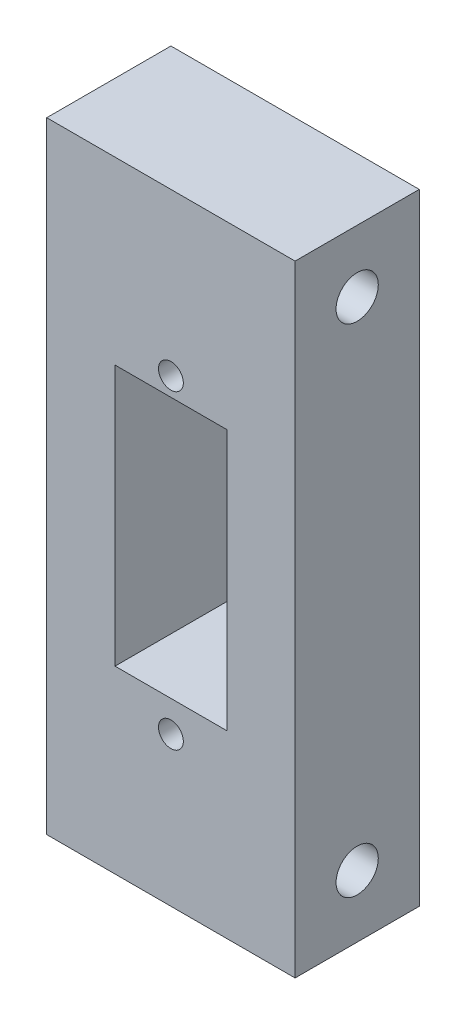
ISO-10303-21;
HEADER;
FILE_DESCRIPTION(('STEP AP214'),'2;1');
FILE_NAME('part.step','',(''),(''),'','','');
FILE_SCHEMA(('AUTOMOTIVE_DESIGN { 1 0 10303 214 1 1 1 1 }'));
ENDSEC;
DATA;
#1=APPLICATION_CONTEXT('core data for automotive mechanical design processes');
#2=APPLICATION_PROTOCOL_DEFINITION('international standard','automotive_design',2000,#1);
#3=PRODUCT_CONTEXT('',#1,'mechanical');
#4=PRODUCT('Part','Part','',(#3));
#5=PRODUCT_RELATED_PRODUCT_CATEGORY('part','',(#4));
#6=PRODUCT_DEFINITION_FORMATION('','',#4);
#7=PRODUCT_DEFINITION_CONTEXT('part definition',#1,'design');
#8=PRODUCT_DEFINITION('design','',#6,#7);
#9=PRODUCT_DEFINITION_SHAPE('','',#8);
#10=(LENGTH_UNIT() NAMED_UNIT(*) SI_UNIT(.MILLI.,.METRE.));
#11=(NAMED_UNIT(*) PLANE_ANGLE_UNIT() SI_UNIT($,.RADIAN.));
#12=(NAMED_UNIT(*) SI_UNIT($,.STERADIAN.) SOLID_ANGLE_UNIT());
#13=UNCERTAINTY_MEASURE_WITH_UNIT(LENGTH_MEASURE(1.E-05),#10,'distance_accuracy_value','');
#14=(GEOMETRIC_REPRESENTATION_CONTEXT(3) GLOBAL_UNCERTAINTY_ASSIGNED_CONTEXT((#13)) GLOBAL_UNIT_ASSIGNED_CONTEXT((#10,
#11,#12)) REPRESENTATION_CONTEXT('',''));
#15=CARTESIAN_POINT('',(0.,0.,0.));
#16=DIRECTION('',(0.,0.,1.));
#17=DIRECTION('',(1.,0.,0.));
#18=AXIS2_PLACEMENT_3D('',#15,#16,#17);
#19=CARTESIAN_POINT('',(0.,0.,10.));
#20=DIRECTION('',(0.,0.,-1.));
#21=DIRECTION('',(-1.,0.,0.));
#22=AXIS2_PLACEMENT_3D('',#19,#20,#21);
#23=PLANE('',#22);
#24=DIRECTION('',(0.,-1.,0.));
#25=VECTOR('',#24,1.);
#26=CARTESIAN_POINT('',(-10.,25.,10.));
#27=LINE('',#26,#25);
#28=CARTESIAN_POINT('',(-10.,25.,10.));
#29=VERTEX_POINT('',#28);
#30=CARTESIAN_POINT('',(-10.,-25.,10.));
#31=VERTEX_POINT('',#30);
#32=EDGE_CURVE('E141',#29,#31,#27,.T.);
#33=ORIENTED_EDGE('',*,*,#32,.T.);
#34=DIRECTION('',(1.,0.,0.));
#35=VECTOR('',#34,1.);
#36=CARTESIAN_POINT('',(10.,-25.,10.));
#37=LINE('',#36,#35);
#38=CARTESIAN_POINT('',(10.,-25.,10.));
#39=VERTEX_POINT('',#38);
#40=EDGE_CURVE('E144',#31,#39,#37,.T.);
#41=ORIENTED_EDGE('',*,*,#40,.T.);
#42=DIRECTION('',(0.,1.,0.));
#43=VECTOR('',#42,1.);
#44=CARTESIAN_POINT('',(10.,25.,10.));
#45=LINE('',#44,#43);
#46=CARTESIAN_POINT('',(10.,25.,10.));
#47=VERTEX_POINT('',#46);
#48=EDGE_CURVE('E147',#39,#47,#45,.T.);
#49=ORIENTED_EDGE('',*,*,#48,.T.);
#50=DIRECTION('',(-1.,0.,0.));
#51=VECTOR('',#50,1.);
#52=CARTESIAN_POINT('',(10.,25.,10.));
#53=LINE('',#52,#51);
#54=EDGE_CURVE('E149',#47,#29,#53,.T.);
#55=ORIENTED_EDGE('',*,*,#54,.T.);
#56=EDGE_LOOP('',(#33,#41,#49,#55));
#57=FACE_BOUND('',#56,.T.);
#58=DIRECTION('',(0.,-1.,0.));
#59=VECTOR('',#58,1.);
#60=CARTESIAN_POINT('',(-4.5,-10.5,10.));
#61=LINE('',#60,#59);
#62=CARTESIAN_POINT('',(-4.5,10.5,10.));
#63=VERTEX_POINT('',#62);
#64=CARTESIAN_POINT('',(-4.5,-10.5,10.));
#65=VERTEX_POINT('',#64);
#66=EDGE_CURVE('E102',#63,#65,#61,.T.);
#67=ORIENTED_EDGE('',*,*,#66,.F.);
#68=DIRECTION('',(-1.,0.,0.));
#69=VECTOR('',#68,1.);
#70=CARTESIAN_POINT('',(4.5,10.5,10.));
#71=LINE('',#70,#69);
#72=CARTESIAN_POINT('',(4.5,10.5,10.));
#73=VERTEX_POINT('',#72);
#74=EDGE_CURVE('E125',#73,#63,#71,.T.);
#75=ORIENTED_EDGE('',*,*,#74,.F.);
#76=DIRECTION('',(0.,1.,0.));
#77=VECTOR('',#76,1.);
#78=CARTESIAN_POINT('',(4.5,-10.5,10.));
#79=LINE('',#78,#77);
#80=CARTESIAN_POINT('',(4.5,-10.5,10.));
#81=VERTEX_POINT('',#80);
#82=EDGE_CURVE('E123',#81,#73,#79,.T.);
#83=ORIENTED_EDGE('',*,*,#82,.F.);
#84=DIRECTION('',(1.,0.,0.));
#85=VECTOR('',#84,1.);
#86=CARTESIAN_POINT('',(4.5,-10.5,10.));
#87=LINE('',#86,#85);
#88=EDGE_CURVE('E110',#65,#81,#87,.T.);
#89=ORIENTED_EDGE('',*,*,#88,.F.);
#90=EDGE_LOOP('',(#67,#75,#83,#89));
#91=FACE_BOUND('',#90,.T.);
#92=CARTESIAN_POINT('',(0.,-13.,10.));
#93=DIRECTION('',(0.,0.,1.));
#94=DIRECTION('',(1.,0.,0.));
#95=AXIS2_PLACEMENT_3D('',#92,#93,#94);
#96=CIRCLE('',#95,1.);
#97=CARTESIAN_POINT('',(1.,-13.,10.));
#98=VERTEX_POINT('',#97);
#99=EDGE_CURVE('E131',#98,#98,#96,.T.);
#100=ORIENTED_EDGE('',*,*,#99,.F.);
#101=EDGE_LOOP('',(#100));
#102=FACE_BOUND('',#101,.T.);
#103=CARTESIAN_POINT('',(0.,12.,10.));
#104=DIRECTION('',(0.,0.,1.));
#105=DIRECTION('',(1.,0.,0.));
#106=AXIS2_PLACEMENT_3D('',#103,#104,#105);
#107=CIRCLE('',#106,1.);
#108=CARTESIAN_POINT('',(1.,12.,10.));
#109=VERTEX_POINT('',#108);
#110=EDGE_CURVE('E254',#109,#109,#107,.T.);
#111=ORIENTED_EDGE('',*,*,#110,.F.);
#112=EDGE_LOOP('',(#111));
#113=FACE_BOUND('',#112,.T.);
#114=ADVANCED_FACE('F37',(#57,#91,#102,#113),#23,.F.);
#115=CARTESIAN_POINT('',(0.,0.,0.));
#116=DIRECTION('',(0.,0.,-1.));
#117=DIRECTION('',(-1.,0.,0.));
#118=AXIS2_PLACEMENT_3D('',#115,#116,#117);
#119=PLANE('',#118);
#120=CARTESIAN_POINT('',(0.,-13.,0.));
#121=DIRECTION('',(0.,0.,1.));
#122=DIRECTION('',(1.,0.,0.));
#123=AXIS2_PLACEMENT_3D('',#120,#121,#122);
#124=CIRCLE('',#123,1.);
#125=CARTESIAN_POINT('',(1.,-13.,0.));
#126=VERTEX_POINT('',#125);
#127=EDGE_CURVE('E257',#126,#126,#124,.T.);
#128=ORIENTED_EDGE('',*,*,#127,.T.);
#129=EDGE_LOOP('',(#128));
#130=FACE_BOUND('',#129,.T.);
#131=DIRECTION('',(0.,-1.,0.));
#132=VECTOR('',#131,1.);
#133=CARTESIAN_POINT('',(-10.,25.,0.));
#134=LINE('',#133,#132);
#135=CARTESIAN_POINT('',(-10.,25.,0.));
#136=VERTEX_POINT('',#135);
#137=CARTESIAN_POINT('',(-10.,-25.,0.));
#138=VERTEX_POINT('',#137);
#139=EDGE_CURVE('E118',#136,#138,#134,.T.);
#140=ORIENTED_EDGE('',*,*,#139,.F.);
#141=DIRECTION('',(-1.,0.,0.));
#142=VECTOR('',#141,1.);
#143=CARTESIAN_POINT('',(10.,25.,0.));
#144=LINE('',#143,#142);
#145=CARTESIAN_POINT('',(10.,25.,0.));
#146=VERTEX_POINT('',#145);
#147=EDGE_CURVE('E145',#146,#136,#144,.T.);
#148=ORIENTED_EDGE('',*,*,#147,.F.);
#149=DIRECTION('',(0.,1.,0.));
#150=VECTOR('',#149,1.);
#151=CARTESIAN_POINT('',(10.,25.,0.));
#152=LINE('',#151,#150);
#153=CARTESIAN_POINT('',(10.,-25.,0.));
#154=VERTEX_POINT('',#153);
#155=EDGE_CURVE('E156',#154,#146,#152,.T.);
#156=ORIENTED_EDGE('',*,*,#155,.F.);
#157=DIRECTION('',(1.,0.,0.));
#158=VECTOR('',#157,1.);
#159=CARTESIAN_POINT('',(10.,-25.,0.));
#160=LINE('',#159,#158);
#161=EDGE_CURVE('E154',#138,#154,#160,.T.);
#162=ORIENTED_EDGE('',*,*,#161,.F.);
#163=EDGE_LOOP('',(#140,#148,#156,#162));
#164=FACE_BOUND('',#163,.T.);
#165=DIRECTION('',(-1.,0.,0.));
#166=VECTOR('',#165,1.);
#167=CARTESIAN_POINT('',(4.5,10.5,0.));
#168=LINE('',#167,#166);
#169=CARTESIAN_POINT('',(4.5,10.5,0.));
#170=VERTEX_POINT('',#169);
#171=CARTESIAN_POINT('',(-4.5,10.5,0.));
#172=VERTEX_POINT('',#171);
#173=EDGE_CURVE('E111',#170,#172,#168,.T.);
#174=ORIENTED_EDGE('',*,*,#173,.T.);
#175=DIRECTION('',(0.,-1.,0.));
#176=VECTOR('',#175,1.);
#177=CARTESIAN_POINT('',(-4.5,-10.5,0.));
#178=LINE('',#177,#176);
#179=CARTESIAN_POINT('',(-4.5,-10.5,0.));
#180=VERTEX_POINT('',#179);
#181=EDGE_CURVE('E60',#172,#180,#178,.T.);
#182=ORIENTED_EDGE('',*,*,#181,.T.);
#183=DIRECTION('',(1.,0.,0.));
#184=VECTOR('',#183,1.);
#185=CARTESIAN_POINT('',(4.5,-10.5,0.));
#186=LINE('',#185,#184);
#187=CARTESIAN_POINT('',(4.5,-10.5,0.));
#188=VERTEX_POINT('',#187);
#189=EDGE_CURVE('E117',#180,#188,#186,.T.);
#190=ORIENTED_EDGE('',*,*,#189,.T.);
#191=DIRECTION('',(0.,1.,0.));
#192=VECTOR('',#191,1.);
#193=CARTESIAN_POINT('',(4.5,-10.5,0.));
#194=LINE('',#193,#192);
#195=EDGE_CURVE('E133',#188,#170,#194,.T.);
#196=ORIENTED_EDGE('',*,*,#195,.T.);
#197=EDGE_LOOP('',(#174,#182,#190,#196));
#198=FACE_BOUND('',#197,.T.);
#199=CARTESIAN_POINT('',(0.,12.,0.));
#200=DIRECTION('',(0.,0.,1.));
#201=DIRECTION('',(1.,0.,0.));
#202=AXIS2_PLACEMENT_3D('',#199,#200,#201);
#203=CIRCLE('',#202,1.);
#204=CARTESIAN_POINT('',(1.,12.,0.));
#205=VERTEX_POINT('',#204);
#206=EDGE_CURVE('E246',#205,#205,#203,.T.);
#207=ORIENTED_EDGE('',*,*,#206,.T.);
#208=EDGE_LOOP('',(#207));
#209=FACE_BOUND('',#208,.T.);
#210=ADVANCED_FACE('F174',(#130,#164,#198,#209),#119,.T.);
#211=CARTESIAN_POINT('',(-10.,25.,10.));
#212=DIRECTION('',(1.,0.,0.));
#213=DIRECTION('',(0.,0.,-1.));
#214=AXIS2_PLACEMENT_3D('',#211,#212,#213);
#215=PLANE('',#214);
#216=CARTESIAN_POINT('',(-10.,-20.,5.));
#217=DIRECTION('',(1.,0.,0.));
#218=DIRECTION('',(0.,0.,-1.));
#219=AXIS2_PLACEMENT_3D('',#216,#217,#218);
#220=CIRCLE('',#219,1.7);
#221=CARTESIAN_POINT('',(-10.,-20.,3.3));
#222=VERTEX_POINT('',#221);
#223=EDGE_CURVE('E240',#222,#222,#220,.T.);
#224=ORIENTED_EDGE('',*,*,#223,.T.);
#225=EDGE_LOOP('',(#224));
#226=FACE_BOUND('',#225,.T.);
#227=CARTESIAN_POINT('',(-10.,20.,5.));
#228=DIRECTION('',(1.,0.,0.));
#229=DIRECTION('',(0.,0.,-1.));
#230=AXIS2_PLACEMENT_3D('',#227,#228,#229);
#231=CIRCLE('',#230,1.7);
#232=CARTESIAN_POINT('',(-10.,20.,3.3));
#233=VERTEX_POINT('',#232);
#234=EDGE_CURVE('E244',#233,#233,#231,.T.);
#235=ORIENTED_EDGE('',*,*,#234,.T.);
#236=EDGE_LOOP('',(#235));
#237=FACE_BOUND('',#236,.T.);
#238=ORIENTED_EDGE('',*,*,#139,.T.);
#239=DIRECTION('',(0.,0.,-1.));
#240=VECTOR('',#239,1.);
#241=CARTESIAN_POINT('',(-10.,-25.,10.));
#242=LINE('',#241,#240);
#243=EDGE_CURVE('E11',#31,#138,#242,.T.);
#244=ORIENTED_EDGE('',*,*,#243,.F.);
#245=ORIENTED_EDGE('',*,*,#32,.F.);
#246=DIRECTION('',(0.,0.,-1.));
#247=VECTOR('',#246,1.);
#248=CARTESIAN_POINT('',(-10.,25.,10.));
#249=LINE('',#248,#247);
#250=EDGE_CURVE('E151',#29,#136,#249,.T.);
#251=ORIENTED_EDGE('',*,*,#250,.T.);
#252=EDGE_LOOP('',(#238,#244,#245,#251));
#253=FACE_BOUND('',#252,.T.);
#254=ADVANCED_FACE('F39',(#226,#237,#253),#215,.F.);
#255=CARTESIAN_POINT('',(10.,-25.,10.));
#256=DIRECTION('',(0.,1.,0.));
#257=DIRECTION('',(0.,0.,1.));
#258=AXIS2_PLACEMENT_3D('',#255,#256,#257);
#259=PLANE('',#258);
#260=ORIENTED_EDGE('',*,*,#161,.T.);
#261=DIRECTION('',(0.,0.,-1.));
#262=VECTOR('',#261,1.);
#263=CARTESIAN_POINT('',(10.,-25.,10.));
#264=LINE('',#263,#262);
#265=EDGE_CURVE('E45',#39,#154,#264,.T.);
#266=ORIENTED_EDGE('',*,*,#265,.F.);
#267=ORIENTED_EDGE('',*,*,#40,.F.);
#268=ORIENTED_EDGE('',*,*,#243,.T.);
#269=EDGE_LOOP('',(#260,#266,#267,#268));
#270=FACE_BOUND('',#269,.T.);
#271=ADVANCED_FACE('F184',(#270),#259,.F.);
#272=CARTESIAN_POINT('',(10.,25.,10.));
#273=DIRECTION('',(-1.,0.,0.));
#274=DIRECTION('',(0.,0.,1.));
#275=AXIS2_PLACEMENT_3D('',#272,#273,#274);
#276=PLANE('',#275);
#277=CARTESIAN_POINT('',(10.,-20.,5.));
#278=DIRECTION('',(1.,0.,0.));
#279=DIRECTION('',(0.,0.,-1.));
#280=AXIS2_PLACEMENT_3D('',#277,#278,#279);
#281=CIRCLE('',#280,1.7);
#282=CARTESIAN_POINT('',(10.,-20.,3.3));
#283=VERTEX_POINT('',#282);
#284=EDGE_CURVE('E243',#283,#283,#281,.T.);
#285=ORIENTED_EDGE('',*,*,#284,.F.);
#286=EDGE_LOOP('',(#285));
#287=FACE_BOUND('',#286,.T.);
#288=CARTESIAN_POINT('',(10.,20.,5.));
#289=DIRECTION('',(1.,0.,0.));
#290=DIRECTION('',(0.,0.,-1.));
#291=AXIS2_PLACEMENT_3D('',#288,#289,#290);
#292=CIRCLE('',#291,1.7);
#293=CARTESIAN_POINT('',(10.,20.,3.3));
#294=VERTEX_POINT('',#293);
#295=EDGE_CURVE('E249',#294,#294,#292,.T.);
#296=ORIENTED_EDGE('',*,*,#295,.F.);
#297=EDGE_LOOP('',(#296));
#298=FACE_BOUND('',#297,.T.);
#299=ORIENTED_EDGE('',*,*,#155,.T.);
#300=DIRECTION('',(0.,0.,-1.));
#301=VECTOR('',#300,1.);
#302=CARTESIAN_POINT('',(10.,25.,10.));
#303=LINE('',#302,#301);
#304=EDGE_CURVE('E161',#47,#146,#303,.T.);
#305=ORIENTED_EDGE('',*,*,#304,.F.);
#306=ORIENTED_EDGE('',*,*,#48,.F.);
#307=ORIENTED_EDGE('',*,*,#265,.T.);
#308=EDGE_LOOP('',(#299,#305,#306,#307));
#309=FACE_BOUND('',#308,.T.);
#310=ADVANCED_FACE('F168',(#287,#298,#309),#276,.F.);
#311=CARTESIAN_POINT('',(10.,25.,10.));
#312=DIRECTION('',(0.,-1.,0.));
#313=DIRECTION('',(0.,0.,-1.));
#314=AXIS2_PLACEMENT_3D('',#311,#312,#313);
#315=PLANE('',#314);
#316=ORIENTED_EDGE('',*,*,#147,.T.);
#317=ORIENTED_EDGE('',*,*,#250,.F.);
#318=ORIENTED_EDGE('',*,*,#54,.F.);
#319=ORIENTED_EDGE('',*,*,#304,.T.);
#320=EDGE_LOOP('',(#316,#317,#318,#319));
#321=FACE_BOUND('',#320,.T.);
#322=ADVANCED_FACE('F178',(#321),#315,.F.);
#323=CARTESIAN_POINT('',(-4.5,-10.5,10.));
#324=DIRECTION('',(1.,0.,0.));
#325=DIRECTION('',(0.,0.,-1.));
#326=AXIS2_PLACEMENT_3D('',#323,#324,#325);
#327=PLANE('',#326);
#328=ORIENTED_EDGE('',*,*,#181,.F.);
#329=DIRECTION('',(0.,0.,-1.));
#330=VECTOR('',#329,1.);
#331=CARTESIAN_POINT('',(-4.5,10.5,10.));
#332=LINE('',#331,#330);
#333=EDGE_CURVE('E106',#63,#172,#332,.T.);
#334=ORIENTED_EDGE('',*,*,#333,.F.);
#335=ORIENTED_EDGE('',*,*,#66,.T.);
#336=DIRECTION('',(0.,0.,-1.));
#337=VECTOR('',#336,1.);
#338=CARTESIAN_POINT('',(-4.5,-10.5,10.));
#339=LINE('',#338,#337);
#340=EDGE_CURVE('E105',#65,#180,#339,.T.);
#341=ORIENTED_EDGE('',*,*,#340,.T.);
#342=EDGE_LOOP('',(#328,#334,#335,#341));
#343=FACE_BOUND('',#342,.T.);
#344=ADVANCED_FACE('F104',(#343),#327,.T.);
#345=CARTESIAN_POINT('',(4.5,-10.5,10.));
#346=DIRECTION('',(0.,1.,0.));
#347=DIRECTION('',(0.,0.,1.));
#348=AXIS2_PLACEMENT_3D('',#345,#346,#347);
#349=PLANE('',#348);
#350=ORIENTED_EDGE('',*,*,#189,.F.);
#351=ORIENTED_EDGE('',*,*,#340,.F.);
#352=ORIENTED_EDGE('',*,*,#88,.T.);
#353=DIRECTION('',(0.,0.,-1.));
#354=VECTOR('',#353,1.);
#355=CARTESIAN_POINT('',(4.5,-10.5,10.));
#356=LINE('',#355,#354);
#357=EDGE_CURVE('E119',#81,#188,#356,.T.);
#358=ORIENTED_EDGE('',*,*,#357,.T.);
#359=EDGE_LOOP('',(#350,#351,#352,#358));
#360=FACE_BOUND('',#359,.T.);
#361=ADVANCED_FACE('F114',(#360),#349,.T.);
#362=CARTESIAN_POINT('',(4.5,-10.5,10.));
#363=DIRECTION('',(-1.,0.,0.));
#364=DIRECTION('',(0.,0.,1.));
#365=AXIS2_PLACEMENT_3D('',#362,#363,#364);
#366=PLANE('',#365);
#367=ORIENTED_EDGE('',*,*,#195,.F.);
#368=ORIENTED_EDGE('',*,*,#357,.F.);
#369=ORIENTED_EDGE('',*,*,#82,.T.);
#370=DIRECTION('',(0.,0.,-1.));
#371=VECTOR('',#370,1.);
#372=CARTESIAN_POINT('',(4.5,10.5,10.));
#373=LINE('',#372,#371);
#374=EDGE_CURVE('E52',#73,#170,#373,.T.);
#375=ORIENTED_EDGE('',*,*,#374,.T.);
#376=EDGE_LOOP('',(#367,#368,#369,#375));
#377=FACE_BOUND('',#376,.T.);
#378=ADVANCED_FACE('F210',(#377),#366,.T.);
#379=CARTESIAN_POINT('',(4.5,10.5,10.));
#380=DIRECTION('',(0.,-1.,0.));
#381=DIRECTION('',(0.,0.,-1.));
#382=AXIS2_PLACEMENT_3D('',#379,#380,#381);
#383=PLANE('',#382);
#384=ORIENTED_EDGE('',*,*,#173,.F.);
#385=ORIENTED_EDGE('',*,*,#374,.F.);
#386=ORIENTED_EDGE('',*,*,#74,.T.);
#387=ORIENTED_EDGE('',*,*,#333,.T.);
#388=EDGE_LOOP('',(#384,#385,#386,#387));
#389=FACE_BOUND('',#388,.T.);
#390=ADVANCED_FACE('F214',(#389),#383,.T.);
#391=CARTESIAN_POINT('',(0.,-13.,10.));
#392=DIRECTION('',(0.,0.,-1.));
#393=DIRECTION('',(-1.,0.,0.));
#394=AXIS2_PLACEMENT_3D('',#391,#392,#393);
#395=CYLINDRICAL_SURFACE('',#394,1.);
#396=ORIENTED_EDGE('',*,*,#99,.T.);
#397=EDGE_LOOP('',(#396));
#398=FACE_BOUND('',#397,.T.);
#399=ORIENTED_EDGE('',*,*,#127,.F.);
#400=EDGE_LOOP('',(#399));
#401=FACE_BOUND('',#400,.T.);
#402=ADVANCED_FACE('F220',(#398,#401),#395,.F.);
#403=CARTESIAN_POINT('',(0.,12.,10.));
#404=DIRECTION('',(0.,0.,-1.));
#405=DIRECTION('',(-1.,0.,0.));
#406=AXIS2_PLACEMENT_3D('',#403,#404,#405);
#407=CYLINDRICAL_SURFACE('',#406,1.);
#408=ORIENTED_EDGE('',*,*,#110,.T.);
#409=EDGE_LOOP('',(#408));
#410=FACE_BOUND('',#409,.T.);
#411=ORIENTED_EDGE('',*,*,#206,.F.);
#412=EDGE_LOOP('',(#411));
#413=FACE_BOUND('',#412,.T.);
#414=ADVANCED_FACE('F223',(#410,#413),#407,.F.);
#415=CARTESIAN_POINT('',(-10.,20.,5.));
#416=DIRECTION('',(1.,0.,0.));
#417=DIRECTION('',(0.,0.,-1.));
#418=AXIS2_PLACEMENT_3D('',#415,#416,#417);
#419=CYLINDRICAL_SURFACE('',#418,1.7);
#420=ORIENTED_EDGE('',*,*,#234,.F.);
#421=EDGE_LOOP('',(#420));
#422=FACE_BOUND('',#421,.T.);
#423=ORIENTED_EDGE('',*,*,#295,.T.);
#424=EDGE_LOOP('',(#423));
#425=FACE_BOUND('',#424,.T.);
#426=ADVANCED_FACE('F227',(#422,#425),#419,.F.);
#427=CARTESIAN_POINT('',(-10.,-20.,5.));
#428=DIRECTION('',(1.,0.,0.));
#429=DIRECTION('',(0.,0.,-1.));
#430=AXIS2_PLACEMENT_3D('',#427,#428,#429);
#431=CYLINDRICAL_SURFACE('',#430,1.7);
#432=ORIENTED_EDGE('',*,*,#223,.F.);
#433=EDGE_LOOP('',(#432));
#434=FACE_BOUND('',#433,.T.);
#435=ORIENTED_EDGE('',*,*,#284,.T.);
#436=EDGE_LOOP('',(#435));
#437=FACE_BOUND('',#436,.T.);
#438=ADVANCED_FACE('F231',(#434,#437),#431,.F.);
#439=CLOSED_SHELL('',(#114,#210,#254,#271,#310,#322,#344,#361,#378,#390,#402,#414,#426,#438));
#440=MANIFOLD_SOLID_BREP('B2',#439);
#441=ADVANCED_BREP_SHAPE_REPRESENTATION('',(#18,#440),#14);
#442=SHAPE_DEFINITION_REPRESENTATION(#9,#441);
ENDSEC;
END-ISO-10303-21;
